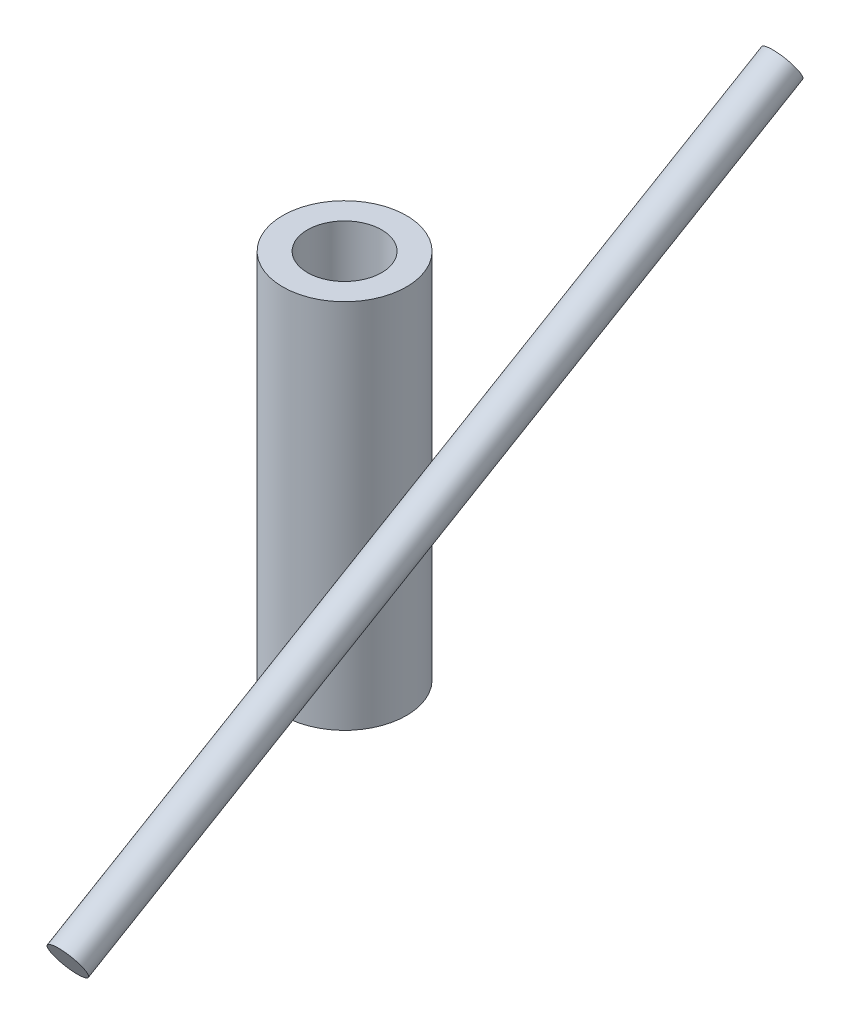
ISO-10303-21;
HEADER;
FILE_DESCRIPTION(('STEP AP214'),'2;1');
FILE_NAME('part.step','',(''),(''),'','','');
FILE_SCHEMA(('AUTOMOTIVE_DESIGN { 1 0 10303 214 1 1 1 1 }'));
ENDSEC;
DATA;
#1=APPLICATION_CONTEXT('core data for automotive mechanical design processes');
#2=APPLICATION_PROTOCOL_DEFINITION('international standard','automotive_design',2000,#1);
#3=PRODUCT_CONTEXT('',#1,'mechanical');
#4=PRODUCT('Part','Part','',(#3));
#5=PRODUCT_RELATED_PRODUCT_CATEGORY('part','',(#4));
#6=PRODUCT_DEFINITION_FORMATION('','',#4);
#7=PRODUCT_DEFINITION_CONTEXT('part definition',#1,'design');
#8=PRODUCT_DEFINITION('design','',#6,#7);
#9=PRODUCT_DEFINITION_SHAPE('','',#8);
#10=(LENGTH_UNIT() NAMED_UNIT(*) SI_UNIT(.MILLI.,.METRE.));
#11=(NAMED_UNIT(*) PLANE_ANGLE_UNIT() SI_UNIT($,.RADIAN.));
#12=(NAMED_UNIT(*) SI_UNIT($,.STERADIAN.) SOLID_ANGLE_UNIT());
#13=UNCERTAINTY_MEASURE_WITH_UNIT(LENGTH_MEASURE(1.E-05),#10,'distance_accuracy_value','');
#14=(GEOMETRIC_REPRESENTATION_CONTEXT(3) GLOBAL_UNCERTAINTY_ASSIGNED_CONTEXT((#13)) GLOBAL_UNIT_ASSIGNED_CONTEXT((#10,
#11,#12)) REPRESENTATION_CONTEXT('',''));
#15=CARTESIAN_POINT('',(0.,0.,0.));
#16=DIRECTION('',(0.,0.,1.));
#17=DIRECTION('',(1.,0.,0.));
#18=AXIS2_PLACEMENT_3D('',#15,#16,#17);
#19=CARTESIAN_POINT('',(6.49999999999995,-16.9999999999995,28.8660700477221));
#20=DIRECTION('',(0.,0.507462686567163,-0.861673732767825));
#21=DIRECTION('',(0.,0.861673732767823,0.507462686567165));
#22=AXIS2_PLACEMENT_3D('',#19,#20,#21);
#23=PLANE('',#22);
#24=CARTESIAN_POINT('',(6.49999999999995,-16.9999999999995,28.8660700477221));
#25=DIRECTION('',(0.,0.507462686567163,-0.861673732767825));
#26=DIRECTION('',(0.,0.861673732767823,0.507462686567165));
#27=AXIS2_PLACEMENT_3D('',#24,#25,#26);
#28=CIRCLE('',#27,1.5);
#29=CARTESIAN_POINT('',(6.49999999999973,-15.7074894008478,29.6272640775728));
#30=VERTEX_POINT('',#29);
#31=EDGE_CURVE('E67',#30,#30,#28,.T.);
#32=ORIENTED_EDGE('',*,*,#31,.F.);
#33=EDGE_LOOP('',(#32));
#34=FACE_BOUND('',#33,.T.);
#35=ADVANCED_FACE('F60',(#34),#23,.F.);
#36=CARTESIAN_POINT('',(6.49999999999984,16.9999999999999,-28.8660700477222));
#37=DIRECTION('',(0.,0.507462686567163,-0.861673732767825));
#38=DIRECTION('',(0.,0.861673732767823,0.507462686567165));
#39=AXIS2_PLACEMENT_3D('',#36,#37,#38);
#40=PLANE('',#39);
#41=CARTESIAN_POINT('',(6.49999999999984,16.9999999999999,-28.8660700477222));
#42=DIRECTION('',(0.,0.507462686567163,-0.861673732767825));
#43=DIRECTION('',(0.,0.861673732767823,0.507462686567165));
#44=AXIS2_PLACEMENT_3D('',#41,#42,#43);
#45=CIRCLE('',#44,1.5);
#46=CARTESIAN_POINT('',(6.49999999999984,18.2925105991518,-28.1048760178716));
#47=VERTEX_POINT('',#46);
#48=EDGE_CURVE('E14',#47,#47,#45,.T.);
#49=ORIENTED_EDGE('',*,*,#48,.T.);
#50=EDGE_LOOP('',(#49));
#51=FACE_BOUND('',#50,.T.);
#52=ADVANCED_FACE('F74',(#51),#40,.T.);
#53=CARTESIAN_POINT('',(6.49999999999995,-16.9999999999995,28.8660700477221));
#54=DIRECTION('',(0.,0.507462686567163,-0.861673732767825));
#55=DIRECTION('',(0.,0.861673732767823,0.507462686567164));
#56=AXIS2_PLACEMENT_3D('',#53,#54,#55);
#57=CYLINDRICAL_SURFACE('',#56,1.5);
#58=ORIENTED_EDGE('',*,*,#48,.F.);
#59=EDGE_LOOP('',(#58));
#60=FACE_BOUND('',#59,.T.);
#61=ORIENTED_EDGE('',*,*,#31,.T.);
#62=EDGE_LOOP('',(#61));
#63=FACE_BOUND('',#62,.T.);
#64=ADVANCED_FACE('F76',(#60,#63),#57,.T.);
#65=CLOSED_SHELL('',(#35,#52,#64));
#66=MANIFOLD_SOLID_BREP('B2',#65);
#67=CARTESIAN_POINT('',(-3.33066907387547E-13,-14.9999999999999,-1.11022302462516E-13));
#68=DIRECTION('',(0.,0.999999999999998,0.));
#69=DIRECTION('',(0.,0.,1.));
#70=AXIS2_PLACEMENT_3D('',#67,#68,#69);
#71=CYLINDRICAL_SURFACE('',#70,5.);
#72=CARTESIAN_POINT('',(-4.58257569495601,0.,-2.));
#73=CARTESIAN_POINT('',(-4.58258022779713,-0.107123689712946,-1.99999540068032));
#74=CARTESIAN_POINT('',(-4.58638433797147,-0.214426294331831,-1.99134173553408));
#75=CARTESIAN_POINT('',(-4.60111083306651,-0.42593908409956,-1.95706710874822));
#76=CARTESIAN_POINT('',(-4.61205140628374,-0.530140654338507,-1.93140279032347));
#77=CARTESIAN_POINT('',(-4.63960410719241,-0.732051808970785,-1.86423554476226));
#78=CARTESIAN_POINT('',(-4.65619484260917,-0.829784243291147,-1.82279228998558));
#79=CARTESIAN_POINT('',(-4.6931467718891,-1.01688535486222,-1.72542013194153));
#80=CARTESIAN_POINT('',(-4.71350714220635,-1.10625585252405,-1.66949439157705));
#81=CARTESIAN_POINT('',(-4.75700861562357,-1.27926031454428,-1.54132201423254));
#82=CARTESIAN_POINT('',(-4.7802391702264,-1.36235639939717,-1.46837936836556));
#83=CARTESIAN_POINT('',(-4.82612457915311,-1.51552902085572,-1.30970909513227));
#84=CARTESIAN_POINT('',(-4.8487792299178,-1.58560100770963,-1.2239770187736));
#85=CARTESIAN_POINT('',(-4.89203407641411,-1.71340639030964,-1.03800631337319));
#86=CARTESIAN_POINT('',(-4.912518036126,-1.77054429968584,-0.937328966419269));
#87=CARTESIAN_POINT('',(-4.9480392770255,-1.86684357017371,-0.726825322068835));
#88=CARTESIAN_POINT('',(-4.96307877403275,-1.90601224624883,-0.617002769077085));
#89=CARTESIAN_POINT('',(-4.98538324990635,-1.96334148599309,-0.396966427039943));
#90=CARTESIAN_POINT('',(-4.99298936770663,-1.98242731397021,-0.287028984858487));
#91=CARTESIAN_POINT('',(-5.00080310687462,-2.00202848578143,-0.0652663285840896));
#92=CARTESIAN_POINT('',(-5.00101348770575,-2.00255075596577,0.0465581658393085));
#93=CARTESIAN_POINT('',(-4.99421962820633,-1.98551723019577,0.262232494702029));
#94=CARTESIAN_POINT('',(-4.98761996771518,-1.96897522724526,0.366177452870415));
#95=CARTESIAN_POINT('',(-4.96849291469173,-1.92000712369707,0.569673109221895));
#96=CARTESIAN_POINT('',(-4.9559650872136,-1.88757985760163,0.669223484391226));
#97=CARTESIAN_POINT('',(-4.92596824457486,-1.80736351712184,0.862897938510557));
#98=CARTESIAN_POINT('',(-4.90842760466257,-1.75935028518466,0.956917623378902));
#99=CARTESIAN_POINT('',(-4.87014585180303,-1.64953499308082,1.13580815074127));
#100=CARTESIAN_POINT('',(-4.84940364267156,-1.58772820689979,1.22067584271787));
#101=CARTESIAN_POINT('',(-4.80521637176127,-1.44735086405607,1.38476882799011));
#102=CARTESIAN_POINT('',(-4.78168326511783,-1.36794610742716,1.46325784526634));
#103=CARTESIAN_POINT('',(-4.73561660973295,-1.19700942816795,1.6061074153927));
#104=CARTESIAN_POINT('',(-4.71308339008095,-1.10547355180433,1.67046334378698));
#105=CARTESIAN_POINT('',(-4.6709689740904,-0.909580977626012,1.78490418871924));
#106=CARTESIAN_POINT('',(-4.65148914057737,-0.804935169661328,1.83453465163625));
#107=CARTESIAN_POINT('',(-4.61887590344113,-0.587784509687821,1.91517625986646));
#108=CARTESIAN_POINT('',(-4.60573837891327,-0.475284815273486,1.94619949837797));
#109=CARTESIAN_POINT('',(-4.58829759702735,-0.252964222532646,1.98695494885488));
#110=CARTESIAN_POINT('',(-4.58350366456169,-0.143399552871496,1.99787209681454));
#111=CARTESIAN_POINT('',(-4.58189497869064,0.076077207759561,2.00156132644289));
#112=CARTESIAN_POINT('',(-4.58507780560368,0.185989183275686,1.99433891059129));
#113=CARTESIAN_POINT('',(-4.59856044359121,0.396458934956995,1.96303289479004));
#114=CARTESIAN_POINT('',(-4.60844457798328,0.497192937400105,1.93993306202387));
#115=CARTESIAN_POINT('',(-4.63370051027372,0.693288404785498,1.87880418691084));
#116=CARTESIAN_POINT('',(-4.64907352488617,0.788648673107206,1.84077183430221));
#117=CARTESIAN_POINT('',(-4.68433781860117,0.975602357795733,1.7491356394815));
#118=CARTESIAN_POINT('',(-4.70438704639203,1.06688618869462,1.6949628682646));
#119=CARTESIAN_POINT('',(-4.74650385157832,1.23948298744165,1.57316522444175));
#120=CARTESIAN_POINT('',(-4.76857224896082,1.32079187279548,1.50553487348178));
#121=CARTESIAN_POINT('',(-4.81420915971454,1.47737340859941,1.35284421168043));
#122=CARTESIAN_POINT('',(-4.83776807285271,1.55175656529168,1.26686542944532));
#123=CARTESIAN_POINT('',(-4.88219794567561,1.68517707660986,1.08308363336838));
#124=CARTESIAN_POINT('',(-4.90306879593156,1.74421380659517,0.985280138466435));
#125=CARTESIAN_POINT('',(-4.93983715900413,1.84504762646338,0.780279934002828));
#126=CARTESIAN_POINT('',(-4.95573586240695,1.88684884417374,0.673085480998589));
#127=CARTESIAN_POINT('',(-4.98072713468936,1.95154885239977,0.452393590914395));
#128=CARTESIAN_POINT('',(-4.9898233970612,1.97445790141061,0.338899610276639));
#129=CARTESIAN_POINT('',(-4.99979008211877,1.99950470165274,0.116816510362451));
#130=CARTESIAN_POINT('',(-5.00115846749778,2.00290012856199,0.00839049265196637));
#131=CARTESIAN_POINT('',(-4.99686042373755,1.99214452061657,-0.207433835792306));
#132=CARTESIAN_POINT('',(-4.99119505948793,1.97799614184446,-0.314832299614391));
#133=CARTESIAN_POINT('',(-4.97371513381854,1.93345321200013,-0.522170901733387));
#134=CARTESIAN_POINT('',(-4.96209480699029,1.90357105524342,-0.622238803864879));
#135=CARTESIAN_POINT('',(-4.93394947767395,1.82894719411892,-0.815922355542676));
#136=CARTESIAN_POINT('',(-4.91742357062888,1.78420274906096,-0.909536811189237));
#137=CARTESIAN_POINT('',(-4.88018094611898,1.67889680664679,-1.09220303880528));
#138=CARTESIAN_POINT('',(-4.85931130687241,1.6177237246748,-1.18087037518748));
#139=CARTESIAN_POINT('',(-4.81589402227106,1.48221146125292,-1.34705404014802));
#140=CARTESIAN_POINT('',(-4.79334568464255,1.40786683039177,-1.42456572919746));
#141=CARTESIAN_POINT('',(-4.74737767367683,1.24268485315132,-1.57120121894455));
#142=CARTESIAN_POINT('',(-4.72399047228127,1.15111142485579,-1.63950871002774));
#143=CARTESIAN_POINT('',(-4.68049656850788,0.957057564279098,-1.75984762763163));
#144=CARTESIAN_POINT('',(-4.66039025195466,0.854575851546507,-1.81187714055803));
#145=CARTESIAN_POINT('',(-4.62758914239091,0.650963813529861,-1.89399048451656));
#146=CARTESIAN_POINT('',(-4.61439096680468,0.550538397287517,-1.92562535665258));
#147=CARTESIAN_POINT('',(-4.59445826034142,0.345510958507321,-1.972719909285));
#148=CARTESIAN_POINT('',(-4.587705722904,0.24092142657571,-1.9882246619167));
#149=CARTESIAN_POINT('',(-4.58391763942112,0.113221760888531,-1.9969220218553));
#150=CARTESIAN_POINT('',(-4.58341531117321,0.0905985196436037,-1.998075307519));
#151=CARTESIAN_POINT('',(-4.58274384722762,0.0453195232027911,-1.99961481124246));
#152=CARTESIAN_POINT('',(-4.58257473595946,0.0226637657448511,-2.00000097306118));
#153=CARTESIAN_POINT('',(-4.58257569495601,0.,-2.));
#154=B_SPLINE_CURVE_WITH_KNOTS('',3,(#72,#73,#74,#75,#76,#77,#78,#79,#80,#81,#82,#83,#84,#85,
#86,#87,#88,#89,#90,#91,#92,#93,#94,#95,#96,#97,#98,#99,#100,#101,#102,#103,#104,#105,#106,#107,
#108,#109,#110,#111,#112,#113,#114,#115,#116,#117,#118,#119,#120,#121,#122,#123,#124,#125,#126,
#127,#128,#129,#130,#131,#132,#133,#134,#135,#136,#137,#138,#139,#140,#141,#142,#143,#144,#145,
#146,#147,#148,#149,#150,#151,#152,#153),.UNSPECIFIED.,.T.,.F.,(4,2,2,2,2,2,2,2,2,2,2,2,2,2,2,2,
2,2,2,2,2,2,2,2,2,2,2,2,2,2,2,2,2,2,2,2,2,2,2,2,4),(0.,0.321277648767664,0.643377335822187,
0.96427082329332,1.28509428823859,1.62255618284416,1.96013574348324,2.31102669091409,
2.66177466969461,2.9955418288717,3.32918445305667,3.644086448303,3.95901155129058,
4.27868300234897,4.59846414940034,4.93924044081362,5.28012807127134,5.63064458717256,
5.98093304800092,6.30982147524419,6.63861014907944,6.94867248085152,7.25880358651647,
7.58151154652713,7.90435114525864,8.25103734246996,8.59773764852766,8.94435487312828,
9.29078375954152,9.61461039755958,9.93838801512596,10.2522199444335,10.5661097782859,
10.8938705113994,11.2217671656422,11.5699625328562,11.918198817592,12.2351666081909,
12.5512463021925,12.619212852096,12.6871843847256),.UNSPECIFIED.);
#155=CARTESIAN_POINT('',(-4.58257569495601,0.,-2.));
#156=VERTEX_POINT('',#155);
#157=EDGE_CURVE('E132',#156,#156,#154,.T.);
#158=ORIENTED_EDGE('',*,*,#157,.F.);
#159=EDGE_LOOP('',(#158));
#160=FACE_BOUND('',#159,.T.);
#161=CARTESIAN_POINT('',(5.,0.,0.));
#162=VERTEX_POINT('',#161);
#163=VERTEX_LOOP('',#162);
#164=FACE_BOUND('',#163,.T.);
#165=CARTESIAN_POINT('',(-3.33066907387547E-13,-14.9999999999999,-1.11022302462516E-13));
#166=DIRECTION('',(0.,0.999999999999998,0.));
#167=DIRECTION('',(0.,0.,1.));
#168=AXIS2_PLACEMENT_3D('',#165,#166,#167);
#169=CIRCLE('',#168,5.);
#170=CARTESIAN_POINT('',(-3.33066907387547E-13,-14.9999999999999,4.99999999999989));
#171=VERTEX_POINT('',#170);
#172=EDGE_CURVE('E58',#171,#171,#169,.T.);
#173=ORIENTED_EDGE('',*,*,#172,.T.);
#174=EDGE_LOOP('',(#173));
#175=FACE_BOUND('',#174,.T.);
#176=CARTESIAN_POINT('',(0.,14.9999999999999,0.));
#177=DIRECTION('',(0.,0.999999999999998,0.));
#178=DIRECTION('',(0.,0.,1.));
#179=AXIS2_PLACEMENT_3D('',#176,#177,#178);
#180=CIRCLE('',#179,5.);
#181=CARTESIAN_POINT('',(0.,14.9999999999999,5.));
#182=VERTEX_POINT('',#181);
#183=EDGE_CURVE('E125',#182,#182,#180,.T.);
#184=ORIENTED_EDGE('',*,*,#183,.F.);
#185=EDGE_LOOP('',(#184));
#186=FACE_BOUND('',#185,.T.);
#187=ADVANCED_FACE('F102',(#160,#164,#175,#186),#71,.T.);
#188=CARTESIAN_POINT('',(-3.33066907387547E-13,-14.9999999999999,-1.11022302462516E-13));
#189=DIRECTION('',(0.,0.999999999999998,0.));
#190=DIRECTION('',(0.,0.,1.));
#191=AXIS2_PLACEMENT_3D('',#188,#189,#190);
#192=PLANE('',#191);
#193=CARTESIAN_POINT('',(-3.33066907387547E-13,-14.9999999999999,-1.11022302462516E-13));
#194=DIRECTION('',(0.,0.999999999999998,0.));
#195=DIRECTION('',(0.,0.,1.));
#196=AXIS2_PLACEMENT_3D('',#193,#194,#195);
#197=CIRCLE('',#196,3.);
#198=CARTESIAN_POINT('',(-3.33066907387547E-13,-14.9999999999999,2.99999999999989));
#199=VERTEX_POINT('',#198);
#200=EDGE_CURVE('E114',#199,#199,#197,.T.);
#201=ORIENTED_EDGE('',*,*,#200,.T.);
#202=EDGE_LOOP('',(#201));
#203=FACE_BOUND('',#202,.T.);
#204=ORIENTED_EDGE('',*,*,#172,.F.);
#205=EDGE_LOOP('',(#204));
#206=FACE_BOUND('',#205,.T.);
#207=ADVANCED_FACE('F119',(#203,#206),#192,.F.);
#208=CARTESIAN_POINT('',(-3.33066907387547E-13,-14.9999999999999,-1.11022302462516E-13));
#209=DIRECTION('',(0.,0.999999999999998,0.));
#210=DIRECTION('',(0.,0.,1.));
#211=AXIS2_PLACEMENT_3D('',#208,#209,#210);
#212=CYLINDRICAL_SURFACE('',#211,3.);
#213=CARTESIAN_POINT('',(-2.23606797749998,0.,-2.));
#214=CARTESIAN_POINT('',(-2.23607753462832,-0.0976283108686028,-1.9999945399773));
#215=CARTESIAN_POINT('',(-2.24258071047481,-0.195290753708764,-1.99278992503663));
#216=CARTESIAN_POINT('',(-2.26731972501663,-0.387119911650791,-1.96458268317733));
#217=CARTESIAN_POINT('',(-2.28557660812741,-0.481280035529575,-1.94355530587867));
#218=CARTESIAN_POINT('',(-2.33056585825597,-0.66273544187767,-1.88935861676636));
#219=CARTESIAN_POINT('',(-2.3572156179464,-0.750087696737588,-1.85630718014214));
#220=CARTESIAN_POINT('',(-2.41584094681866,-0.917865832346613,-1.77934008393544));
#221=CARTESIAN_POINT('',(-2.44781762158862,-0.998290269976498,-1.73542216812178));
#222=CARTESIAN_POINT('',(-2.51946072932054,-1.16364688761694,-1.63002410007733));
#223=CARTESIAN_POINT('',(-2.559549360904,-1.24733211771713,-1.56687435451744));
#224=CARTESIAN_POINT('',(-2.63944827308117,-1.40400270887418,-1.42819219740683));
#225=CARTESIAN_POINT('',(-2.67925824298007,-1.47697752165847,-1.35264773177084));
#226=CARTESIAN_POINT('',(-2.76088818523768,-1.62064365878164,-1.17815690494304));
#227=CARTESIAN_POINT('',(-2.80216785846958,-1.68948251177561,-1.07740643965833));
#228=CARTESIAN_POINT('',(-2.87558484482792,-1.80864209548996,-0.862470964212412));
#229=CARTESIAN_POINT('',(-2.90773236231044,-1.85898351403105,-0.748301152321867));
#230=CARTESIAN_POINT('',(-2.95599907464737,-1.93355640101738,-0.523249073480162));
#231=CARTESIAN_POINT('',(-2.97351175615898,-1.96008334449555,-0.413434725181572));
#232=CARTESIAN_POINT('',(-2.99609745461956,-1.99418448928361,-0.189695448729959));
#233=CARTESIAN_POINT('',(-3.00118613762378,-2.00178255922532,-0.0757758812858659));
#234=CARTESIAN_POINT('',(-2.99855361722973,-1.99782755005084,0.134147050232327));
#235=CARTESIAN_POINT('',(-2.99266264910159,-1.98901094868292,0.230240638008733));
#236=CARTESIAN_POINT('',(-2.97208182790054,-1.95790894864113,0.419238633270922));
#237=CARTESIAN_POINT('',(-2.95739133313124,-1.93562256769645,0.512142807649574));
#238=CARTESIAN_POINT('',(-2.9205209170376,-1.87880431520542,0.692077937671013));
#239=CARTESIAN_POINT('',(-2.89837077982713,-1.84432111480147,0.779130623845853));
#240=CARTESIAN_POINT('',(-2.84821104476319,-1.76444635704725,0.946209150653466));
#241=CARTESIAN_POINT('',(-2.82020037745179,-1.71905280849856,1.02623370496928));
#242=CARTESIAN_POINT('',(-2.75618058450716,-1.61202126254017,1.18828429196335));
#243=CARTESIAN_POINT('',(-2.71960408792051,-1.54903247664725,1.26919148099706));
#244=CARTESIAN_POINT('',(-2.64400601827028,-1.41210132051966,1.41998807498304));
#245=CARTESIAN_POINT('',(-2.60498072815252,-1.33814205406613,1.48986013519452));
#246=CARTESIAN_POINT('',(-2.52150044944169,-1.1680367897866,1.6277223532616));
#247=CARTESIAN_POINT('',(-2.47714320008958,-1.0702289202854,1.69373593126357));
#248=CARTESIAN_POINT('',(-2.39475610831112,-0.862490160779215,1.8083487494549));
#249=CARTESIAN_POINT('',(-2.35671571534887,-0.752580005586065,1.85697718654903));
#250=CARTESIAN_POINT('',(-2.30262870306892,-0.555280937926858,1.92332724567777));
#251=CARTESIAN_POINT('',(-2.28340364577685,-0.470406629943078,1.94590791747532));
#252=CARTESIAN_POINT('',(-2.25409039789641,-0.296960510183142,1.97979555580016));
#253=CARTESIAN_POINT('',(-2.2439863678238,-0.208395388827399,1.99112206964401));
#254=CARTESIAN_POINT('',(-2.23447556987395,-0.0295570135585526,2.00179400148885));
#255=CARTESIAN_POINT('',(-2.23511533866493,0.0607219785200857,2.00108729753103));
#256=CARTESIAN_POINT('',(-2.24709880368975,0.239683833955011,1.9876162971636));
#257=CARTESIAN_POINT('',(-2.25845117648872,0.328365344107347,1.9748422269037));
#258=CARTESIAN_POINT('',(-2.28927977500771,0.497389417549794,1.93899811187037));
#259=CARTESIAN_POINT('',(-2.30833187069777,0.577927709002529,1.91646174529972));
#260=CARTESIAN_POINT('',(-2.35229958533669,0.734126236050257,1.86223041628517));
#261=CARTESIAN_POINT('',(-2.37721717294636,0.809784822962983,1.83053237805352));
#262=CARTESIAN_POINT('',(-2.43611483596199,0.970202003847499,1.75163346599563));
#263=CARTESIAN_POINT('',(-2.47091081434338,1.05375681154266,1.70260028818248));
#264=CARTESIAN_POINT('',(-2.54262514806663,1.2124168026173,1.59352731501439));
#265=CARTESIAN_POINT('',(-2.57954604947564,1.28751151674252,1.53347411883824));
#266=CARTESIAN_POINT('',(-2.66075678321026,1.44396234746768,1.38876657712425));
#267=CARTESIAN_POINT('',(-2.70489452138603,1.52310284824847,1.30160386514195));
#268=CARTESIAN_POINT('',(-2.7877558184168,1.6658166829404,1.11309948866197));
#269=CARTESIAN_POINT('',(-2.82648414789502,1.72940377125678,1.01177047745671));
#270=CARTESIAN_POINT('',(-2.88790821242265,1.82789173891767,0.817487474821477));
#271=CARTESIAN_POINT('',(-2.9122545811105,1.8659565044405,0.726662364886038));
#272=CARTESIAN_POINT('',(-2.95278707867073,1.92860719432049,0.538757079020244));
#273=CARTESIAN_POINT('',(-2.96898009872019,1.95320450285969,0.441682263858472));
#274=CARTESIAN_POINT('',(-2.99178364026773,1.98769696383863,0.243369392303162));
#275=CARTESIAN_POINT('',(-2.99835150856568,1.99752667950664,0.14211483692408));
#276=CARTESIAN_POINT('',(-3.00109821029087,2.00164785141715,-0.0608555465808853));
#277=CARTESIAN_POINT('',(-2.99727800938922,1.99594075195621,-0.162571330953558));
#278=CARTESIAN_POINT('',(-2.98029555977349,1.97034051099531,-0.355757532528162));
#279=CARTESIAN_POINT('',(-2.96783277209896,1.9515090151382,-0.447435143070573));
#280=CARTESIAN_POINT('',(-2.93536106206963,1.9017619905691,-0.626018422997018));
#281=CARTESIAN_POINT('',(-2.91535096747108,1.87084458465274,-0.712923348686772));
#282=CARTESIAN_POINT('',(-2.86791765486197,1.79606129511594,-0.885147296608264));
#283=CARTESIAN_POINT('',(-2.84013248946367,1.75154969250484,-0.970083589200285));
#284=CARTESIAN_POINT('',(-2.7797540823551,1.65184935537397,-1.13155266268336));
#285=CARTESIAN_POINT('',(-2.74715796645285,1.59665423204804,-1.20808037205025));
#286=CARTESIAN_POINT('',(-2.67392931472412,1.46737109766372,-1.36329422201424));
#287=CARTESIAN_POINT('',(-2.63283913877405,1.39167697632587,-1.44042679526107));
#288=CARTESIAN_POINT('',(-2.55053357649519,1.22888645845402,-1.581600222816));
#289=CARTESIAN_POINT('',(-2.50931811970167,1.14178161116585,-1.64563128323923));
#290=CARTESIAN_POINT('',(-2.43384213590317,0.964132409244682,-1.75513253518411));
#291=CARTESIAN_POINT('',(-2.39929086741945,0.874358190049595,-1.80164646897214));
#292=CARTESIAN_POINT('',(-2.33747501591062,0.68671555100681,-1.88115802340272));
#293=CARTESIAN_POINT('',(-2.31019631295319,0.588863306137883,-1.91418190281325));
#294=CARTESIAN_POINT('',(-2.27191051929562,0.409228531575509,-1.959362624709));
#295=CARTESIAN_POINT('',(-2.25863695410195,0.328691763209729,-1.97452228373246));
#296=CARTESIAN_POINT('',(-2.24071519216052,0.165443599495459,-1.99483915818928));
#297=CARTESIAN_POINT('',(-2.23605987841497,0.0827340557394196,-2.00000462703716));
#298=CARTESIAN_POINT('',(-2.23606797749998,0.,-2.));
#299=B_SPLINE_CURVE_WITH_KNOTS('',3,(#213,#214,#215,#216,#217,#218,#219,#220,#221,#222,#223,
#224,#225,#226,#227,#228,#229,#230,#231,#232,#233,#234,#235,#236,#237,#238,#239,#240,#241,#242,
#243,#244,#245,#246,#247,#248,#249,#250,#251,#252,#253,#254,#255,#256,#257,#258,#259,#260,#261,
#262,#263,#264,#265,#266,#267,#268,#269,#270,#271,#272,#273,#274,#275,#276,#277,#278,#279,#280,
#281,#282,#283,#284,#285,#286,#287,#288,#289,#290,#291,#292,#293,#294,#295,#296,#297,#298),
.UNSPECIFIED.,.T.,.F.,(4,2,2,2,2,2,2,2,2,2,2,2,2,2,2,2,2,2,2,2,2,2,2,2,2,2,2,2,2,2,2,2,2,2,2,2,
2,2,2,2,2,2,4),(0.,0.292506930722135,0.585539042259268,0.875772651216237,1.16606657266542,
1.5015467706863,1.83735518436269,2.22167031006274,2.60555429388555,2.94637482063567,
3.28676536688298,3.57539534955733,3.86404638283728,4.15155831973175,4.43912276902987,
4.76447525946628,5.0903341479664,5.4667870350495,5.84260469743956,6.11126090401325,
6.3794496623548,6.64880037638031,6.91836943570594,7.17476451706928,7.43124577644944,
7.73899230052348,8.04711556801516,8.42254684520985,8.79764490572616,9.10070580611727,
9.40351012888497,9.70765229266181,10.0117661844615,10.2937678224972,10.5758132789283,
10.874178629859,11.172722959311,11.5182220628452,11.8639785041861,12.1833412579672,
12.5020793664922,12.7501661630425,12.9980479966543),.UNSPECIFIED.);
#300=CARTESIAN_POINT('',(-2.23606797749998,0.,-2.));
#301=VERTEX_POINT('',#300);
#302=EDGE_CURVE('E106',#301,#301,#299,.T.);
#303=ORIENTED_EDGE('',*,*,#302,.T.);
#304=EDGE_LOOP('',(#303));
#305=FACE_BOUND('',#304,.T.);
#306=ORIENTED_EDGE('',*,*,#200,.F.);
#307=EDGE_LOOP('',(#306));
#308=FACE_BOUND('',#307,.T.);
#309=CARTESIAN_POINT('',(0.,14.9999999999999,0.));
#310=DIRECTION('',(0.,0.999999999999998,0.));
#311=DIRECTION('',(0.,0.,1.));
#312=AXIS2_PLACEMENT_3D('',#309,#310,#311);
#313=CIRCLE('',#312,3.);
#314=CARTESIAN_POINT('',(0.,14.9999999999999,3.));
#315=VERTEX_POINT('',#314);
#316=EDGE_CURVE('E127',#315,#315,#313,.T.);
#317=ORIENTED_EDGE('',*,*,#316,.T.);
#318=EDGE_LOOP('',(#317));
#319=FACE_BOUND('',#318,.T.);
#320=ADVANCED_FACE('F146',(#305,#308,#319),#212,.F.);
#321=CARTESIAN_POINT('',(0.,14.9999999999999,0.));
#322=DIRECTION('',(0.,0.999999999999998,0.));
#323=DIRECTION('',(0.,0.,1.));
#324=AXIS2_PLACEMENT_3D('',#321,#322,#323);
#325=PLANE('',#324);
#326=ORIENTED_EDGE('',*,*,#183,.T.);
#327=EDGE_LOOP('',(#326));
#328=FACE_BOUND('',#327,.T.);
#329=ORIENTED_EDGE('',*,*,#316,.F.);
#330=EDGE_LOOP('',(#329));
#331=FACE_BOUND('',#330,.T.);
#332=ADVANCED_FACE('F142',(#328,#331),#325,.T.);
#333=CARTESIAN_POINT('',(-15.0000000000001,0.,0.));
#334=DIRECTION('',(1.,0.,0.));
#335=DIRECTION('',(0.,0.,-1.));
#336=AXIS2_PLACEMENT_3D('',#333,#334,#335);
#337=CYLINDRICAL_SURFACE('',#336,2.);
#338=ORIENTED_EDGE('',*,*,#157,.T.);
#339=EDGE_LOOP('',(#338));
#340=FACE_BOUND('',#339,.T.);
#341=ORIENTED_EDGE('',*,*,#302,.F.);
#342=EDGE_LOOP('',(#341));
#343=FACE_BOUND('',#342,.T.);
#344=ADVANCED_FACE('F138',(#340,#343),#337,.F.);
#345=CLOSED_SHELL('',(#187,#207,#320,#332,#344));
#346=MANIFOLD_SOLID_BREP('B8',#345);
#347=ADVANCED_BREP_SHAPE_REPRESENTATION('',(#18,#66,#346),#14);
#348=SHAPE_DEFINITION_REPRESENTATION(#9,#347);
ENDSEC;
END-ISO-10303-21;
